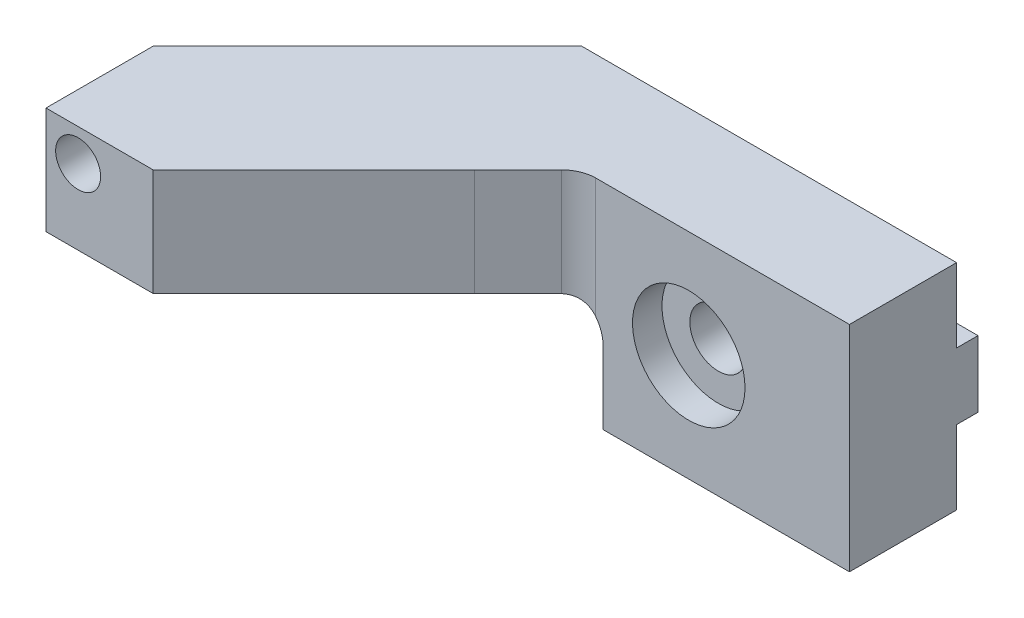
ISO-10303-21;
HEADER;
FILE_DESCRIPTION(('STEP AP214'),'2;1');
FILE_NAME('part.step','',(''),(''),'','','');
FILE_SCHEMA(('AUTOMOTIVE_DESIGN { 1 0 10303 214 1 1 1 1 }'));
ENDSEC;
DATA;
#1=APPLICATION_CONTEXT('core data for automotive mechanical design processes');
#2=APPLICATION_PROTOCOL_DEFINITION('international standard','automotive_design',2000,#1);
#3=PRODUCT_CONTEXT('',#1,'mechanical');
#4=PRODUCT('Part','Part','',(#3));
#5=PRODUCT_RELATED_PRODUCT_CATEGORY('part','',(#4));
#6=PRODUCT_DEFINITION_FORMATION('','',#4);
#7=PRODUCT_DEFINITION_CONTEXT('part definition',#1,'design');
#8=PRODUCT_DEFINITION('design','',#6,#7);
#9=PRODUCT_DEFINITION_SHAPE('','',#8);
#10=(LENGTH_UNIT() NAMED_UNIT(*) SI_UNIT(.MILLI.,.METRE.));
#11=(NAMED_UNIT(*) PLANE_ANGLE_UNIT() SI_UNIT($,.RADIAN.));
#12=(NAMED_UNIT(*) SI_UNIT($,.STERADIAN.) SOLID_ANGLE_UNIT());
#13=UNCERTAINTY_MEASURE_WITH_UNIT(LENGTH_MEASURE(1.E-05),#10,'distance_accuracy_value','');
#14=(GEOMETRIC_REPRESENTATION_CONTEXT(3) GLOBAL_UNCERTAINTY_ASSIGNED_CONTEXT((#13)) GLOBAL_UNIT_ASSIGNED_CONTEXT((#10,
#11,#12)) REPRESENTATION_CONTEXT('',''));
#15=CARTESIAN_POINT('',(0.,0.,0.));
#16=DIRECTION('',(0.,0.,1.));
#17=DIRECTION('',(1.,0.,0.));
#18=AXIS2_PLACEMENT_3D('',#15,#16,#17);
#19=CARTESIAN_POINT('',(0.,0.,10.));
#20=DIRECTION('',(0.,1.,0.));
#21=DIRECTION('',(0.,0.,1.));
#22=AXIS2_PLACEMENT_3D('',#19,#20,#21);
#23=PLANE('',#22);
#24=DIRECTION('',(-1.,0.,0.));
#25=VECTOR('',#24,1.);
#26=CARTESIAN_POINT('',(55.,0.,-10.));
#27=LINE('',#26,#25);
#28=CARTESIAN_POINT('',(60.,0.,-10.));
#29=VERTEX_POINT('',#28);
#30=CARTESIAN_POINT('',(37.,0.,-10.));
#31=VERTEX_POINT('',#30);
#32=EDGE_CURVE('E238',#29,#31,#27,.T.);
#33=ORIENTED_EDGE('',*,*,#32,.T.);
#34=DIRECTION('',(0.,0.,-1.));
#35=VECTOR('',#34,1.);
#36=CARTESIAN_POINT('',(37.,0.,26.));
#37=LINE('',#36,#35);
#38=CARTESIAN_POINT('',(37.,0.,-20.));
#39=VERTEX_POINT('',#38);
#40=EDGE_CURVE('E203',#31,#39,#37,.T.);
#41=ORIENTED_EDGE('',*,*,#40,.T.);
#42=DIRECTION('',(-1.,0.,0.));
#43=VECTOR('',#42,1.);
#44=CARTESIAN_POINT('',(30.,0.,-20.));
#45=LINE('',#44,#43);
#46=CARTESIAN_POINT('',(60.,0.,-20.));
#47=VERTEX_POINT('',#46);
#48=EDGE_CURVE('E253',#47,#39,#45,.T.);
#49=ORIENTED_EDGE('',*,*,#48,.F.);
#50=DIRECTION('',(0.,0.,-1.));
#51=VECTOR('',#50,1.);
#52=CARTESIAN_POINT('',(60.,0.,0.));
#53=LINE('',#52,#51);
#54=EDGE_CURVE('E243',#29,#47,#53,.T.);
#55=ORIENTED_EDGE('',*,*,#54,.F.);
#56=EDGE_LOOP('',(#33,#41,#49,#55));
#57=FACE_BOUND('',#56,.T.);
#58=ADVANCED_FACE('F44',(#57),#23,.F.);
#59=CARTESIAN_POINT('',(0.,20.,10.));
#60=DIRECTION('',(0.,-1.,0.));
#61=DIRECTION('',(0.,0.,-1.));
#62=AXIS2_PLACEMENT_3D('',#59,#60,#61);
#63=PLANE('',#62);
#64=DIRECTION('',(1.,0.,0.));
#65=VECTOR('',#64,1.);
#66=CARTESIAN_POINT('',(30.,20.,-20.));
#67=LINE('',#66,#65);
#68=CARTESIAN_POINT('',(24.9999999999998,20.,-20.));
#69=VERTEX_POINT('',#68);
#70=CARTESIAN_POINT('',(60.,20.,-20.));
#71=VERTEX_POINT('',#70);
#72=EDGE_CURVE('E257',#69,#71,#67,.T.);
#73=ORIENTED_EDGE('',*,*,#72,.F.);
#74=DIRECTION('',(-0.707106781186544,0.,0.707106781186551));
#75=VECTOR('',#74,1.);
#76=CARTESIAN_POINT('',(-2.49999999999995,20.,7.50000000000007));
#77=LINE('',#76,#75);
#78=CARTESIAN_POINT('',(5.00000000000004,20.,0.));
#79=VERTEX_POINT('',#78);
#80=EDGE_CURVE('E274',#69,#79,#77,.T.);
#81=ORIENTED_EDGE('',*,*,#80,.T.);
#82=DIRECTION('',(0.,0.,-1.));
#83=VECTOR('',#82,1.);
#84=CARTESIAN_POINT('',(5.00000000000004,20.,10.));
#85=LINE('',#84,#83);
#86=CARTESIAN_POINT('',(5.00000000000004,20.,10.));
#87=VERTEX_POINT('',#86);
#88=EDGE_CURVE('E250',#87,#79,#85,.T.);
#89=ORIENTED_EDGE('',*,*,#88,.F.);
#90=DIRECTION('',(-1.,0.,0.));
#91=VECTOR('',#90,1.);
#92=CARTESIAN_POINT('',(0.,20.,10.));
#93=LINE('',#92,#91);
#94=CARTESIAN_POINT('',(14.9999999999999,20.,10.));
#95=VERTEX_POINT('',#94);
#96=EDGE_CURVE('E266',#95,#87,#93,.T.);
#97=ORIENTED_EDGE('',*,*,#96,.F.);
#98=DIRECTION('',(0.707106781186549,0.,-0.707106781186546));
#99=VECTOR('',#98,1.);
#100=CARTESIAN_POINT('',(30.,20.,-5.));
#101=LINE('',#100,#99);
#102=CARTESIAN_POINT('',(30.,20.,-5.));
#103=VERTEX_POINT('',#102);
#104=EDGE_CURVE('E288',#95,#103,#101,.T.);
#105=ORIENTED_EDGE('',*,*,#104,.T.);
#106=DIRECTION('',(-0.707106781186549,0.,0.707106781186547));
#107=VECTOR('',#106,1.);
#108=CARTESIAN_POINT('',(40.,20.,-15.));
#109=LINE('',#108,#107);
#110=CARTESIAN_POINT('',(34.0700640302673,20.,-9.07006403026729));
#111=VERTEX_POINT('',#110);
#112=EDGE_CURVE('E291',#103,#111,#109,.F.);
#113=ORIENTED_EDGE('',*,*,#112,.T.);
#114=CARTESIAN_POINT('',(36.3151280605346,20.,-6.825));
#115=DIRECTION('',(0.,-1.,0.));
#116=DIRECTION('',(0.,0.,-1.));
#117=AXIS2_PLACEMENT_3D('',#114,#115,#116);
#118=CIRCLE('',#117,3.175);
#119=CARTESIAN_POINT('',(36.3151280605346,20.,-10.));
#120=VERTEX_POINT('',#119);
#121=EDGE_CURVE('E299',#111,#120,#118,.T.);
#122=ORIENTED_EDGE('',*,*,#121,.T.);
#123=DIRECTION('',(-1.,0.,0.));
#124=VECTOR('',#123,1.);
#125=CARTESIAN_POINT('',(55.,20.,-10.));
#126=LINE('',#125,#124);
#127=CARTESIAN_POINT('',(60.,20.,-10.));
#128=VERTEX_POINT('',#127);
#129=EDGE_CURVE('E242',#128,#120,#126,.T.);
#130=ORIENTED_EDGE('',*,*,#129,.F.);
#131=DIRECTION('',(0.,0.,1.));
#132=VECTOR('',#131,1.);
#133=CARTESIAN_POINT('',(60.,20.,0.));
#134=LINE('',#133,#132);
#135=EDGE_CURVE('E315',#71,#128,#134,.T.);
#136=ORIENTED_EDGE('',*,*,#135,.F.);
#137=EDGE_LOOP('',(#73,#81,#89,#97,#105,#113,#122,#130,#136));
#138=FACE_BOUND('',#137,.T.);
#139=ADVANCED_FACE('F373',(#138),#63,.F.);
#140=CARTESIAN_POINT('',(0.,0.,-20.));
#141=DIRECTION('',(0.,0.,-1.));
#142=DIRECTION('',(-1.,0.,0.));
#143=AXIS2_PLACEMENT_3D('',#140,#141,#142);
#144=PLANE('',#143);
#145=DIRECTION('',(1.,0.,0.));
#146=VECTOR('',#145,1.);
#147=CARTESIAN_POINT('',(60.,13.1,-20.));
#148=LINE('',#147,#146);
#149=CARTESIAN_POINT('',(53.3739865975118,13.1,-20.));
#150=VERTEX_POINT('',#149);
#151=CARTESIAN_POINT('',(60.,13.1,-20.));
#152=VERTEX_POINT('',#151);
#153=EDGE_CURVE('E181',#150,#152,#148,.T.);
#154=ORIENTED_EDGE('',*,*,#153,.F.);
#155=DIRECTION('',(0.,-1.,0.));
#156=VECTOR('',#155,1.);
#157=CARTESIAN_POINT('',(53.3739865975118,6.9,-20.));
#158=LINE('',#157,#156);
#159=CARTESIAN_POINT('',(53.3739865975118,6.9,-20.));
#160=VERTEX_POINT('',#159);
#161=EDGE_CURVE('E312',#150,#160,#158,.T.);
#162=ORIENTED_EDGE('',*,*,#161,.T.);
#163=DIRECTION('',(-1.,0.,0.));
#164=VECTOR('',#163,1.);
#165=CARTESIAN_POINT('',(60.,6.9,-20.));
#166=LINE('',#165,#164);
#167=CARTESIAN_POINT('',(60.,6.9,-20.));
#168=VERTEX_POINT('',#167);
#169=EDGE_CURVE('E437',#168,#160,#166,.T.);
#170=ORIENTED_EDGE('',*,*,#169,.F.);
#171=DIRECTION('',(0.,1.,0.));
#172=VECTOR('',#171,1.);
#173=CARTESIAN_POINT('',(60.,0.,-20.));
#174=LINE('',#173,#172);
#175=EDGE_CURVE('E187',#47,#168,#174,.T.);
#176=ORIENTED_EDGE('',*,*,#175,.F.);
#177=ORIENTED_EDGE('',*,*,#48,.T.);
#178=DIRECTION('',(0.,-1.,0.));
#179=VECTOR('',#178,1.);
#180=CARTESIAN_POINT('',(37.,10.,-20.));
#181=LINE('',#180,#179);
#182=CARTESIAN_POINT('',(37.,6.82499999999999,-20.));
#183=VERTEX_POINT('',#182);
#184=EDGE_CURVE('E196',#183,#39,#181,.T.);
#185=ORIENTED_EDGE('',*,*,#184,.F.);
#186=CARTESIAN_POINT('',(33.825,6.82499999999999,-20.));
#187=DIRECTION('',(0.,0.,-1.));
#188=DIRECTION('',(-1.,0.,0.));
#189=AXIS2_PLACEMENT_3D('',#186,#187,#188);
#190=CIRCLE('',#189,3.175);
#191=CARTESIAN_POINT('',(33.825,10.,-20.));
#192=VERTEX_POINT('',#191);
#193=EDGE_CURVE('E339',#183,#192,#190,.F.);
#194=ORIENTED_EDGE('',*,*,#193,.T.);
#195=DIRECTION('',(1.,0.,0.));
#196=VECTOR('',#195,1.);
#197=CARTESIAN_POINT('',(5.00000000000004,10.,-20.));
#198=LINE('',#197,#196);
#199=CARTESIAN_POINT('',(24.9999999999998,10.,-20.));
#200=VERTEX_POINT('',#199);
#201=EDGE_CURVE('E189',#200,#192,#198,.T.);
#202=ORIENTED_EDGE('',*,*,#201,.F.);
#203=DIRECTION('',(0.,1.,0.));
#204=VECTOR('',#203,1.);
#205=CARTESIAN_POINT('',(24.9999999999998,0.,-20.));
#206=LINE('',#205,#204);
#207=EDGE_CURVE('E213',#200,#69,#206,.T.);
#208=ORIENTED_EDGE('',*,*,#207,.T.);
#209=ORIENTED_EDGE('',*,*,#72,.T.);
#210=EDGE_CURVE('E237',#152,#71,#174,.T.);
#211=ORIENTED_EDGE('',*,*,#210,.F.);
#212=EDGE_LOOP('',(#154,#162,#170,#176,#177,#185,#194,#202,#208,#209,#211));
#213=FACE_BOUND('',#212,.T.);
#214=CARTESIAN_POINT('',(45.,10.,-20.));
#215=DIRECTION('',(0.,0.,1.));
#216=DIRECTION('',(1.,0.,0.));
#217=AXIS2_PLACEMENT_3D('',#214,#215,#216);
#218=CIRCLE('',#217,2.64999999999999);
#219=CARTESIAN_POINT('',(47.65,10.,-20.));
#220=VERTEX_POINT('',#219);
#221=EDGE_CURVE('E224',#220,#220,#218,.T.);
#222=ORIENTED_EDGE('',*,*,#221,.T.);
#223=EDGE_LOOP('',(#222));
#224=FACE_BOUND('',#223,.T.);
#225=ADVANCED_FACE('F380',(#213,#224),#144,.T.);
#226=CARTESIAN_POINT('',(40.,0.,-15.));
#227=DIRECTION('',(-0.707106781186547,0.,-0.707106781186549));
#228=DIRECTION('',(0.,-1.,0.));
#229=AXIS2_PLACEMENT_3D('',#226,#227,#228);
#230=PLANE('',#229);
#231=DIRECTION('',(0.707106781186549,0.,-0.707106781186547));
#232=VECTOR('',#231,1.);
#233=CARTESIAN_POINT('',(40.,10.,-15.));
#234=LINE('',#233,#232);
#235=CARTESIAN_POINT('',(33.825,10.,-8.82500000000003));
#236=VERTEX_POINT('',#235);
#237=CARTESIAN_POINT('',(30.,10.,-5.00000000000003));
#238=VERTEX_POINT('',#237);
#239=EDGE_CURVE('E207',#236,#238,#234,.F.);
#240=ORIENTED_EDGE('',*,*,#239,.F.);
#241=CARTESIAN_POINT('',(33.825,6.82499999999999,-8.82500000000004));
#242=DIRECTION('',(-0.707106781186547,0.,-0.707106781186549));
#243=DIRECTION('',(-0.707106781186549,0.,0.707106781186547));
#244=AXIS2_PLACEMENT_3D('',#241,#242,#243);
#245=ELLIPSE('',#244,4.49012806053457,3.175);
#246=CARTESIAN_POINT('',(34.0700640302673,9.99052817410762,-9.07006403026729));
#247=VERTEX_POINT('',#246);
#248=EDGE_CURVE('E342',#236,#247,#245,.T.);
#249=ORIENTED_EDGE('',*,*,#248,.T.);
#250=DIRECTION('',(0.,1.,0.));
#251=VECTOR('',#250,1.);
#252=CARTESIAN_POINT('',(34.0700640302673,0.,-9.07006403026729));
#253=LINE('',#252,#251);
#254=EDGE_CURVE('E67',#247,#111,#253,.T.);
#255=ORIENTED_EDGE('',*,*,#254,.T.);
#256=ORIENTED_EDGE('',*,*,#112,.F.);
#257=DIRECTION('',(0.,-1.,0.));
#258=VECTOR('',#257,1.);
#259=CARTESIAN_POINT('',(30.,0.,-5.));
#260=LINE('',#259,#258);
#261=EDGE_CURVE('E278',#103,#238,#260,.T.);
#262=ORIENTED_EDGE('',*,*,#261,.T.);
#263=EDGE_LOOP('',(#240,#249,#255,#256,#262));
#264=FACE_BOUND('',#263,.T.);
#265=ADVANCED_FACE('F357',(#264),#230,.F.);
#266=CARTESIAN_POINT('',(0.,0.,10.));
#267=DIRECTION('',(0.,0.,-1.));
#268=DIRECTION('',(-1.,0.,0.));
#269=AXIS2_PLACEMENT_3D('',#266,#267,#268);
#270=PLANE('',#269);
#271=CARTESIAN_POINT('',(8.,17.,10.));
#272=DIRECTION('',(0.,0.,1.));
#273=DIRECTION('',(1.,0.,0.));
#274=AXIS2_PLACEMENT_3D('',#271,#272,#273);
#275=CIRCLE('',#274,2.1);
#276=CARTESIAN_POINT('',(10.1,17.,10.));
#277=VERTEX_POINT('',#276);
#278=EDGE_CURVE('E261',#277,#277,#275,.T.);
#279=ORIENTED_EDGE('',*,*,#278,.F.);
#280=EDGE_LOOP('',(#279));
#281=FACE_BOUND('',#280,.T.);
#282=DIRECTION('',(0.,-1.,0.));
#283=VECTOR('',#282,1.);
#284=CARTESIAN_POINT('',(5.00000000000004,20.,10.));
#285=LINE('',#284,#283);
#286=CARTESIAN_POINT('',(5.00000000000004,10.,10.));
#287=VERTEX_POINT('',#286);
#288=EDGE_CURVE('E246',#87,#287,#285,.T.);
#289=ORIENTED_EDGE('',*,*,#288,.T.);
#290=DIRECTION('',(1.,0.,0.));
#291=VECTOR('',#290,1.);
#292=CARTESIAN_POINT('',(0.,10.,10.));
#293=LINE('',#292,#291);
#294=CARTESIAN_POINT('',(14.9999999999999,10.,10.));
#295=VERTEX_POINT('',#294);
#296=EDGE_CURVE('E233',#287,#295,#293,.T.);
#297=ORIENTED_EDGE('',*,*,#296,.T.);
#298=DIRECTION('',(0.,1.,0.));
#299=VECTOR('',#298,1.);
#300=CARTESIAN_POINT('',(14.9999999999999,20.,10.));
#301=LINE('',#300,#299);
#302=EDGE_CURVE('E285',#295,#95,#301,.T.);
#303=ORIENTED_EDGE('',*,*,#302,.T.);
#304=ORIENTED_EDGE('',*,*,#96,.T.);
#305=EDGE_LOOP('',(#289,#297,#303,#304));
#306=FACE_BOUND('',#305,.T.);
#307=ADVANCED_FACE('F417',(#281,#306),#270,.F.);
#308=CARTESIAN_POINT('',(8.,17.,10.));
#309=DIRECTION('',(0.,0.,1.));
#310=DIRECTION('',(1.,0.,0.));
#311=AXIS2_PLACEMENT_3D('',#308,#309,#310);
#312=CYLINDRICAL_SURFACE('',#311,2.1);
#313=CARTESIAN_POINT('',(8.,17.,-2.99999999999999));
#314=DIRECTION('',(0.707106781186551,0.,0.707106781186544));
#315=DIRECTION('',(-0.707106781186544,0.,0.707106781186551));
#316=AXIS2_PLACEMENT_3D('',#313,#314,#315);
#317=ELLIPSE('',#316,2.96984848098351,2.1);
#318=CARTESIAN_POINT('',(5.9,17.,-0.89999999999997));
#319=VERTEX_POINT('',#318);
#320=EDGE_CURVE('E265',#319,#319,#317,.T.);
#321=ORIENTED_EDGE('',*,*,#320,.F.);
#322=EDGE_LOOP('',(#321));
#323=FACE_BOUND('',#322,.T.);
#324=ORIENTED_EDGE('',*,*,#278,.T.);
#325=EDGE_LOOP('',(#324));
#326=FACE_BOUND('',#325,.T.);
#327=ADVANCED_FACE('F392',(#323,#326),#312,.F.);
#328=CARTESIAN_POINT('',(15.,20.,-10.0000000000001));
#329=DIRECTION('',(0.707106781186551,0.,0.707106781186544));
#330=DIRECTION('',(0.,1.,0.));
#331=AXIS2_PLACEMENT_3D('',#328,#329,#330);
#332=PLANE('',#331);
#333=ORIENTED_EDGE('',*,*,#207,.F.);
#334=DIRECTION('',(-0.707106781186544,0.,0.707106781186551));
#335=VECTOR('',#334,1.);
#336=CARTESIAN_POINT('',(15.,10.,-10.0000000000001));
#337=LINE('',#336,#335);
#338=CARTESIAN_POINT('',(5.00000000000004,10.,0.));
#339=VERTEX_POINT('',#338);
#340=EDGE_CURVE('E229',#200,#339,#337,.T.);
#341=ORIENTED_EDGE('',*,*,#340,.T.);
#342=DIRECTION('',(0.,-1.,0.));
#343=VECTOR('',#342,1.);
#344=CARTESIAN_POINT('',(5.00000000000004,0.,0.));
#345=LINE('',#344,#343);
#346=EDGE_CURVE('E270',#79,#339,#345,.T.);
#347=ORIENTED_EDGE('',*,*,#346,.F.);
#348=ORIENTED_EDGE('',*,*,#80,.F.);
#349=EDGE_LOOP('',(#333,#341,#347,#348));
#350=FACE_BOUND('',#349,.T.);
#351=ORIENTED_EDGE('',*,*,#320,.T.);
#352=EDGE_LOOP('',(#351));
#353=FACE_BOUND('',#352,.T.);
#354=ADVANCED_FACE('F386',(#350,#353),#332,.F.);
#355=CARTESIAN_POINT('',(30.,0.,-5.));
#356=DIRECTION('',(0.707106781186546,0.,0.707106781186549));
#357=DIRECTION('',(0.,1.,0.));
#358=AXIS2_PLACEMENT_3D('',#355,#356,#357);
#359=PLANE('',#358);
#360=DIRECTION('',(-0.707106781186549,0.,0.707106781186546));
#361=VECTOR('',#360,1.);
#362=CARTESIAN_POINT('',(30.,10.,-5.));
#363=LINE('',#362,#361);
#364=EDGE_CURVE('E210',#238,#295,#363,.T.);
#365=ORIENTED_EDGE('',*,*,#364,.F.);
#366=ORIENTED_EDGE('',*,*,#261,.F.);
#367=ORIENTED_EDGE('',*,*,#104,.F.);
#368=ORIENTED_EDGE('',*,*,#302,.F.);
#369=EDGE_LOOP('',(#365,#366,#367,#368));
#370=FACE_BOUND('',#369,.T.);
#371=ADVANCED_FACE('F391',(#370),#359,.T.);
#372=CARTESIAN_POINT('',(5.00000000000004,20.,10.));
#373=DIRECTION('',(1.,0.,0.));
#374=DIRECTION('',(0.,1.,0.));
#375=AXIS2_PLACEMENT_3D('',#372,#373,#374);
#376=PLANE('',#375);
#377=ORIENTED_EDGE('',*,*,#346,.T.);
#378=DIRECTION('',(0.,0.,1.));
#379=VECTOR('',#378,1.);
#380=CARTESIAN_POINT('',(5.00000000000004,10.,10.));
#381=LINE('',#380,#379);
#382=EDGE_CURVE('E302',#339,#287,#381,.T.);
#383=ORIENTED_EDGE('',*,*,#382,.T.);
#384=ORIENTED_EDGE('',*,*,#288,.F.);
#385=ORIENTED_EDGE('',*,*,#88,.T.);
#386=EDGE_LOOP('',(#377,#383,#384,#385));
#387=FACE_BOUND('',#386,.T.);
#388=ADVANCED_FACE('F396',(#387),#376,.F.);
#389=CARTESIAN_POINT('',(55.,20.,-10.));
#390=DIRECTION('',(0.,0.,-1.));
#391=DIRECTION('',(0.,1.,0.));
#392=AXIS2_PLACEMENT_3D('',#389,#390,#391);
#393=PLANE('',#392);
#394=CARTESIAN_POINT('',(45.,10.,-10.));
#395=DIRECTION('',(0.,0.,-1.));
#396=DIRECTION('',(0.,1.,0.));
#397=AXIS2_PLACEMENT_3D('',#394,#395,#396);
#398=CIRCLE('',#397,5.25);
#399=CARTESIAN_POINT('',(45.,15.25,-9.99999999999999));
#400=VERTEX_POINT('',#399);
#401=EDGE_CURVE('E228',#400,#400,#398,.T.);
#402=ORIENTED_EDGE('',*,*,#401,.T.);
#403=EDGE_LOOP('',(#402));
#404=FACE_BOUND('',#403,.T.);
#405=DIRECTION('',(0.,-1.,0.));
#406=VECTOR('',#405,1.);
#407=CARTESIAN_POINT('',(36.3151280605346,20.,-10.));
#408=LINE('',#407,#406);
#409=CARTESIAN_POINT('',(36.3151280605346,8.79474293808569,-10.));
#410=VERTEX_POINT('',#409);
#411=EDGE_CURVE('E60',#120,#410,#408,.T.);
#412=ORIENTED_EDGE('',*,*,#411,.T.);
#413=CARTESIAN_POINT('',(33.825,6.82499999999999,-10.));
#414=DIRECTION('',(0.,0.,-1.));
#415=DIRECTION('',(0.,1.,0.));
#416=AXIS2_PLACEMENT_3D('',#413,#414,#415);
#417=CIRCLE('',#416,3.175);
#418=CARTESIAN_POINT('',(37.,6.82499999999999,-10.));
#419=VERTEX_POINT('',#418);
#420=EDGE_CURVE('E12',#410,#419,#417,.T.);
#421=ORIENTED_EDGE('',*,*,#420,.T.);
#422=DIRECTION('',(0.,-1.,0.));
#423=VECTOR('',#422,1.);
#424=CARTESIAN_POINT('',(37.,20.,-10.));
#425=LINE('',#424,#423);
#426=EDGE_CURVE('E306',#419,#31,#425,.T.);
#427=ORIENTED_EDGE('',*,*,#426,.T.);
#428=ORIENTED_EDGE('',*,*,#32,.F.);
#429=DIRECTION('',(0.,-1.,0.));
#430=VECTOR('',#429,1.);
#431=CARTESIAN_POINT('',(60.,0.,-10.));
#432=LINE('',#431,#430);
#433=EDGE_CURVE('E318',#128,#29,#432,.T.);
#434=ORIENTED_EDGE('',*,*,#433,.F.);
#435=ORIENTED_EDGE('',*,*,#129,.T.);
#436=EDGE_LOOP('',(#412,#421,#427,#428,#434,#435));
#437=FACE_BOUND('',#436,.T.);
#438=ADVANCED_FACE('F360',(#404,#437),#393,.F.);
#439=CARTESIAN_POINT('',(60.,0.,0.));
#440=DIRECTION('',(-1.,0.,0.));
#441=DIRECTION('',(0.,0.,1.));
#442=AXIS2_PLACEMENT_3D('',#439,#440,#441);
#443=PLANE('',#442);
#444=ORIENTED_EDGE('',*,*,#175,.T.);
#445=DIRECTION('',(0.,0.,1.));
#446=VECTOR('',#445,1.);
#447=CARTESIAN_POINT('',(60.,6.9,-22.));
#448=LINE('',#447,#446);
#449=CARTESIAN_POINT('',(60.,6.9,-22.));
#450=VERTEX_POINT('',#449);
#451=EDGE_CURVE('E163',#450,#168,#448,.T.);
#452=ORIENTED_EDGE('',*,*,#451,.F.);
#453=DIRECTION('',(0.,-1.,0.));
#454=VECTOR('',#453,1.);
#455=CARTESIAN_POINT('',(60.,13.1,-22.));
#456=LINE('',#455,#454);
#457=CARTESIAN_POINT('',(60.,13.1,-22.));
#458=VERTEX_POINT('',#457);
#459=EDGE_CURVE('E171',#458,#450,#456,.T.);
#460=ORIENTED_EDGE('',*,*,#459,.F.);
#461=DIRECTION('',(0.,0.,1.));
#462=VECTOR('',#461,1.);
#463=CARTESIAN_POINT('',(60.,13.1,-22.));
#464=LINE('',#463,#462);
#465=EDGE_CURVE('E190',#458,#152,#464,.T.);
#466=ORIENTED_EDGE('',*,*,#465,.T.);
#467=ORIENTED_EDGE('',*,*,#210,.T.);
#468=ORIENTED_EDGE('',*,*,#135,.T.);
#469=ORIENTED_EDGE('',*,*,#433,.T.);
#470=ORIENTED_EDGE('',*,*,#54,.T.);
#471=EDGE_LOOP('',(#444,#452,#460,#466,#467,#468,#469,#470));
#472=FACE_BOUND('',#471,.T.);
#473=ADVANCED_FACE('F184',(#472),#443,.F.);
#474=CARTESIAN_POINT('',(36.3151280605346,0.,-6.825));
#475=DIRECTION('',(0.,-1.,0.));
#476=DIRECTION('',(1.,0.,0.));
#477=AXIS2_PLACEMENT_3D('',#474,#475,#476);
#478=CYLINDRICAL_SURFACE('',#477,3.175);
#479=ORIENTED_EDGE('',*,*,#254,.F.);
#480=CARTESIAN_POINT('',(34.0700640302673,9.99052817410762,-9.07006403026729));
#481=CARTESIAN_POINT('',(34.1198843310403,9.98667550481113,-9.1199020817209));
#482=CARTESIAN_POINT('',(34.1713420377904,9.98150444344247,-9.1680247976551));
#483=CARTESIAN_POINT('',(34.2771333372922,9.96809372550535,-9.26059527204235));
#484=CARTESIAN_POINT('',(34.3314685194196,9.95985235756084,-9.30504096402109));
#485=CARTESIAN_POINT('',(34.4425818386245,9.93986849968148,-9.38997411204807));
#486=CARTESIAN_POINT('',(34.4993609595455,9.92812458825071,-9.43045995212729));
#487=CARTESIAN_POINT('',(34.6147923853492,9.90077134755665,-9.50721640601247));
#488=CARTESIAN_POINT('',(34.6734442787109,9.88516286246772,-9.54348793784957));
#489=CARTESIAN_POINT('',(34.7922628769229,9.84971245073883,-9.61179406392724));
#490=CARTESIAN_POINT('',(34.8524347047509,9.82985383157213,-9.64381112071087));
#491=CARTESIAN_POINT('',(34.9734101305252,9.78573073777844,-9.70336162911802));
#492=CARTESIAN_POINT('',(35.0342139527978,9.76146464460807,-9.73089342656428));
#493=CARTESIAN_POINT('',(35.155612406976,9.70848227019761,-9.7814271550456));
#494=CARTESIAN_POINT('',(35.2162072170953,9.67977447733361,-9.80443754025555));
#495=CARTESIAN_POINT('',(35.3366113394028,9.61789269027288,-9.84612519765089));
#496=CARTESIAN_POINT('',(35.3964203659037,9.58471711849019,-9.86480093288568));
#497=CARTESIAN_POINT('',(35.56802045523,9.48199766317418,-9.91305359286104));
#498=CARTESIAN_POINT('',(35.6779528472844,9.40667730805555,-9.9372338593807));
#499=CARTESIAN_POINT('',(35.8886390844867,9.2416031651499,-9.97304716908463));
#500=CARTESIAN_POINT('',(35.9893867545771,9.15183977753373,-9.98467182703789));
#501=CARTESIAN_POINT('',(36.12498915254,9.01453825373359,-9.99456736867766));
#502=CARTESIAN_POINT('',(36.1647605710174,8.9719844679131,-9.99667282326678));
#503=CARTESIAN_POINT('',(36.2418061419178,8.88486389733704,-9.9993860390835));
#504=CARTESIAN_POINT('',(36.279087724549,8.84030383361247,-9.99999846971068));
#505=CARTESIAN_POINT('',(36.3151280605346,8.79474293808569,-10.));
#506=B_SPLINE_CURVE_WITH_KNOTS('',3,(#480,#481,#482,#483,#484,#485,#486,#487,#488,#489,#490,
#491,#492,#493,#494,#495,#496,#497,#498,#499,#500,#501,#502,#503,#504,#505),.UNSPECIFIED.,.F.,
.F.,(4,2,2,2,2,2,2,2,2,2,2,2,4),(0.,0.211696705398247,0.42351158663309,0.635412549501768,
0.847267265668197,1.05996983880675,1.27275068057809,1.48512979570544,1.69758410012089,
2.10199692693788,2.50667967314052,2.68144526101756,2.85566356815856),.UNSPECIFIED.);
#507=EDGE_CURVE('E54',#247,#410,#506,.T.);
#508=ORIENTED_EDGE('',*,*,#507,.T.);
#509=ORIENTED_EDGE('',*,*,#411,.F.);
#510=ORIENTED_EDGE('',*,*,#121,.F.);
#511=EDGE_LOOP('',(#479,#508,#509,#510));
#512=FACE_BOUND('',#511,.T.);
#513=ADVANCED_FACE('F350',(#512),#478,.F.);
#514=CARTESIAN_POINT('',(5.00000000000004,10.,17.));
#515=DIRECTION('',(0.,1.,0.));
#516=DIRECTION('',(-1.,0.,0.));
#517=AXIS2_PLACEMENT_3D('',#514,#515,#516);
#518=PLANE('',#517);
#519=ORIENTED_EDGE('',*,*,#201,.T.);
#520=DIRECTION('',(0.,0.,-1.));
#521=VECTOR('',#520,1.);
#522=CARTESIAN_POINT('',(33.825,9.99999999999999,-10.));
#523=LINE('',#522,#521);
#524=EDGE_CURVE('E336',#192,#236,#523,.F.);
#525=ORIENTED_EDGE('',*,*,#524,.T.);
#526=ORIENTED_EDGE('',*,*,#239,.T.);
#527=ORIENTED_EDGE('',*,*,#364,.T.);
#528=ORIENTED_EDGE('',*,*,#296,.F.);
#529=ORIENTED_EDGE('',*,*,#382,.F.);
#530=ORIENTED_EDGE('',*,*,#340,.F.);
#531=EDGE_LOOP('',(#519,#525,#526,#527,#528,#529,#530));
#532=FACE_BOUND('',#531,.T.);
#533=ADVANCED_FACE('F355',(#532),#518,.F.);
#534=CARTESIAN_POINT('',(45.,10.,10.));
#535=DIRECTION('',(0.,0.,1.));
#536=DIRECTION('',(1.,0.,0.));
#537=AXIS2_PLACEMENT_3D('',#534,#535,#536);
#538=CYLINDRICAL_SURFACE('',#537,5.25);
#539=CARTESIAN_POINT('',(45.,10.,-12.75));
#540=DIRECTION('',(0.,0.,1.));
#541=DIRECTION('',(1.,0.,0.));
#542=AXIS2_PLACEMENT_3D('',#539,#540,#541);
#543=CIRCLE('',#542,5.25);
#544=CARTESIAN_POINT('',(50.25,10.,-12.75));
#545=VERTEX_POINT('',#544);
#546=EDGE_CURVE('E216',#545,#545,#543,.T.);
#547=ORIENTED_EDGE('',*,*,#546,.F.);
#548=EDGE_LOOP('',(#547));
#549=FACE_BOUND('',#548,.T.);
#550=ORIENTED_EDGE('',*,*,#401,.F.);
#551=EDGE_LOOP('',(#550));
#552=FACE_BOUND('',#551,.T.);
#553=ADVANCED_FACE('F508',(#549,#552),#538,.F.);
#554=CARTESIAN_POINT('',(45.,10.,10.));
#555=DIRECTION('',(0.,0.,1.));
#556=DIRECTION('',(1.,0.,0.));
#557=AXIS2_PLACEMENT_3D('',#554,#555,#556);
#558=CYLINDRICAL_SURFACE('',#557,2.64999999999999);
#559=ORIENTED_EDGE('',*,*,#221,.F.);
#560=EDGE_LOOP('',(#559));
#561=FACE_BOUND('',#560,.T.);
#562=CARTESIAN_POINT('',(45.,10.,-12.75));
#563=DIRECTION('',(0.,0.,1.));
#564=DIRECTION('',(1.,0.,0.));
#565=AXIS2_PLACEMENT_3D('',#562,#563,#564);
#566=CIRCLE('',#565,2.64999999999999);
#567=CARTESIAN_POINT('',(47.65,10.,-12.75));
#568=VERTEX_POINT('',#567);
#569=EDGE_CURVE('E220',#568,#568,#566,.T.);
#570=ORIENTED_EDGE('',*,*,#569,.T.);
#571=EDGE_LOOP('',(#570));
#572=FACE_BOUND('',#571,.T.);
#573=ADVANCED_FACE('F511',(#561,#572),#558,.F.);
#574=CARTESIAN_POINT('',(50.25,10.,-12.75));
#575=DIRECTION('',(0.,0.,-1.));
#576=DIRECTION('',(-1.,0.,0.));
#577=AXIS2_PLACEMENT_3D('',#574,#575,#576);
#578=PLANE('',#577);
#579=ORIENTED_EDGE('',*,*,#569,.F.);
#580=EDGE_LOOP('',(#579));
#581=FACE_BOUND('',#580,.T.);
#582=ORIENTED_EDGE('',*,*,#546,.T.);
#583=EDGE_LOOP('',(#582));
#584=FACE_BOUND('',#583,.T.);
#585=ADVANCED_FACE('F507',(#581,#584),#578,.F.);
#586=CARTESIAN_POINT('',(37.,10.,26.));
#587=DIRECTION('',(1.,0.,0.));
#588=DIRECTION('',(0.,0.,-1.));
#589=AXIS2_PLACEMENT_3D('',#586,#587,#588);
#590=PLANE('',#589);
#591=ORIENTED_EDGE('',*,*,#426,.F.);
#592=DIRECTION('',(0.,0.,-1.));
#593=VECTOR('',#592,1.);
#594=CARTESIAN_POINT('',(37.,6.82499999999999,-20.));
#595=LINE('',#594,#593);
#596=EDGE_CURVE('E332',#419,#183,#595,.T.);
#597=ORIENTED_EDGE('',*,*,#596,.T.);
#598=ORIENTED_EDGE('',*,*,#184,.T.);
#599=ORIENTED_EDGE('',*,*,#40,.F.);
#600=EDGE_LOOP('',(#591,#597,#598,#599));
#601=FACE_BOUND('',#600,.T.);
#602=ADVANCED_FACE('F431',(#601),#590,.F.);
#603=CARTESIAN_POINT('',(60.,6.9,-22.));
#604=DIRECTION('',(0.,1.,0.));
#605=DIRECTION('',(-1.,0.,0.));
#606=AXIS2_PLACEMENT_3D('',#603,#604,#605);
#607=PLANE('',#606);
#608=ORIENTED_EDGE('',*,*,#169,.T.);
#609=CARTESIAN_POINT('',(53.3739865975118,6.9,-26.35));
#610=DIRECTION('',(0.,1.,0.));
#611=DIRECTION('',(-1.,0.,0.));
#612=AXIS2_PLACEMENT_3D('',#609,#610,#611);
#613=CIRCLE('',#612,6.35);
#614=CARTESIAN_POINT('',(58.,6.9,-22.));
#615=VERTEX_POINT('',#614);
#616=EDGE_CURVE('E165',#160,#615,#613,.T.);
#617=ORIENTED_EDGE('',*,*,#616,.T.);
#618=DIRECTION('',(-1.,0.,0.));
#619=VECTOR('',#618,1.);
#620=CARTESIAN_POINT('',(60.,6.9,-22.));
#621=LINE('',#620,#619);
#622=EDGE_CURVE('E159',#450,#615,#621,.T.);
#623=ORIENTED_EDGE('',*,*,#622,.F.);
#624=ORIENTED_EDGE('',*,*,#451,.T.);
#625=EDGE_LOOP('',(#608,#617,#623,#624));
#626=FACE_BOUND('',#625,.T.);
#627=ADVANCED_FACE('F161',(#626),#607,.F.);
#628=CARTESIAN_POINT('',(60.,13.1,-22.));
#629=DIRECTION('',(0.,-1.,0.));
#630=DIRECTION('',(1.,0.,0.));
#631=AXIS2_PLACEMENT_3D('',#628,#629,#630);
#632=PLANE('',#631);
#633=ORIENTED_EDGE('',*,*,#153,.T.);
#634=ORIENTED_EDGE('',*,*,#465,.F.);
#635=DIRECTION('',(1.,0.,0.));
#636=VECTOR('',#635,1.);
#637=CARTESIAN_POINT('',(60.,13.1,-22.));
#638=LINE('',#637,#636);
#639=CARTESIAN_POINT('',(58.,13.1,-22.));
#640=VERTEX_POINT('',#639);
#641=EDGE_CURVE('E176',#640,#458,#638,.T.);
#642=ORIENTED_EDGE('',*,*,#641,.F.);
#643=CARTESIAN_POINT('',(53.3739865975118,13.1,-26.35));
#644=DIRECTION('',(0.,-1.,0.));
#645=DIRECTION('',(1.,0.,0.));
#646=AXIS2_PLACEMENT_3D('',#643,#644,#645);
#647=CIRCLE('',#646,6.35);
#648=EDGE_CURVE('E326',#640,#150,#647,.T.);
#649=ORIENTED_EDGE('',*,*,#648,.T.);
#650=EDGE_LOOP('',(#633,#634,#642,#649));
#651=FACE_BOUND('',#650,.T.);
#652=ADVANCED_FACE('F370',(#651),#632,.F.);
#653=CARTESIAN_POINT('',(0.,0.,-22.));
#654=DIRECTION('',(0.,0.,-1.));
#655=DIRECTION('',(-1.,0.,0.));
#656=AXIS2_PLACEMENT_3D('',#653,#654,#655);
#657=PLANE('',#656);
#658=ORIENTED_EDGE('',*,*,#459,.T.);
#659=ORIENTED_EDGE('',*,*,#622,.T.);
#660=DIRECTION('',(0.,1.,0.));
#661=VECTOR('',#660,1.);
#662=CARTESIAN_POINT('',(58.,13.1,-22.));
#663=LINE('',#662,#661);
#664=EDGE_CURVE('E170',#615,#640,#663,.T.);
#665=ORIENTED_EDGE('',*,*,#664,.T.);
#666=ORIENTED_EDGE('',*,*,#641,.T.);
#667=EDGE_LOOP('',(#658,#659,#665,#666));
#668=FACE_BOUND('',#667,.T.);
#669=ADVANCED_FACE('F174',(#668),#657,.T.);
#670=CARTESIAN_POINT('',(53.3739865975118,13.1,-26.35));
#671=DIRECTION('',(0.,1.,0.));
#672=DIRECTION('',(0.,0.,1.));
#673=AXIS2_PLACEMENT_3D('',#670,#671,#672);
#674=CYLINDRICAL_SURFACE('',#673,6.35);
#675=ORIENTED_EDGE('',*,*,#616,.F.);
#676=ORIENTED_EDGE('',*,*,#161,.F.);
#677=ORIENTED_EDGE('',*,*,#648,.F.);
#678=ORIENTED_EDGE('',*,*,#664,.F.);
#679=EDGE_LOOP('',(#675,#676,#677,#678));
#680=FACE_BOUND('',#679,.T.);
#681=ADVANCED_FACE('F361',(#680),#674,.F.);
#682=CARTESIAN_POINT('',(33.825,6.82499999999999,26.));
#683=DIRECTION('',(0.,0.,1.));
#684=DIRECTION('',(1.,0.,0.));
#685=AXIS2_PLACEMENT_3D('',#682,#683,#684);
#686=CYLINDRICAL_SURFACE('',#685,3.175);
#687=ORIENTED_EDGE('',*,*,#248,.F.);
#688=ORIENTED_EDGE('',*,*,#524,.F.);
#689=ORIENTED_EDGE('',*,*,#193,.F.);
#690=ORIENTED_EDGE('',*,*,#596,.F.);
#691=ORIENTED_EDGE('',*,*,#420,.F.);
#692=ORIENTED_EDGE('',*,*,#507,.F.);
#693=EDGE_LOOP('',(#687,#688,#689,#690,#691,#692));
#694=FACE_BOUND('',#693,.T.);
#695=ADVANCED_FACE('F46',(#694),#686,.F.);
#696=CLOSED_SHELL('',(#58,#139,#225,#265,#307,#327,#354,#371,#388,#438,#473,#513,#533,#553,#573,
#585,#602,#627,#652,#669,#681,#695));
#697=MANIFOLD_SOLID_BREP('B2',#696);
#698=ADVANCED_BREP_SHAPE_REPRESENTATION('',(#18,#697),#14);
#699=SHAPE_DEFINITION_REPRESENTATION(#9,#698);
ENDSEC;
END-ISO-10303-21;
